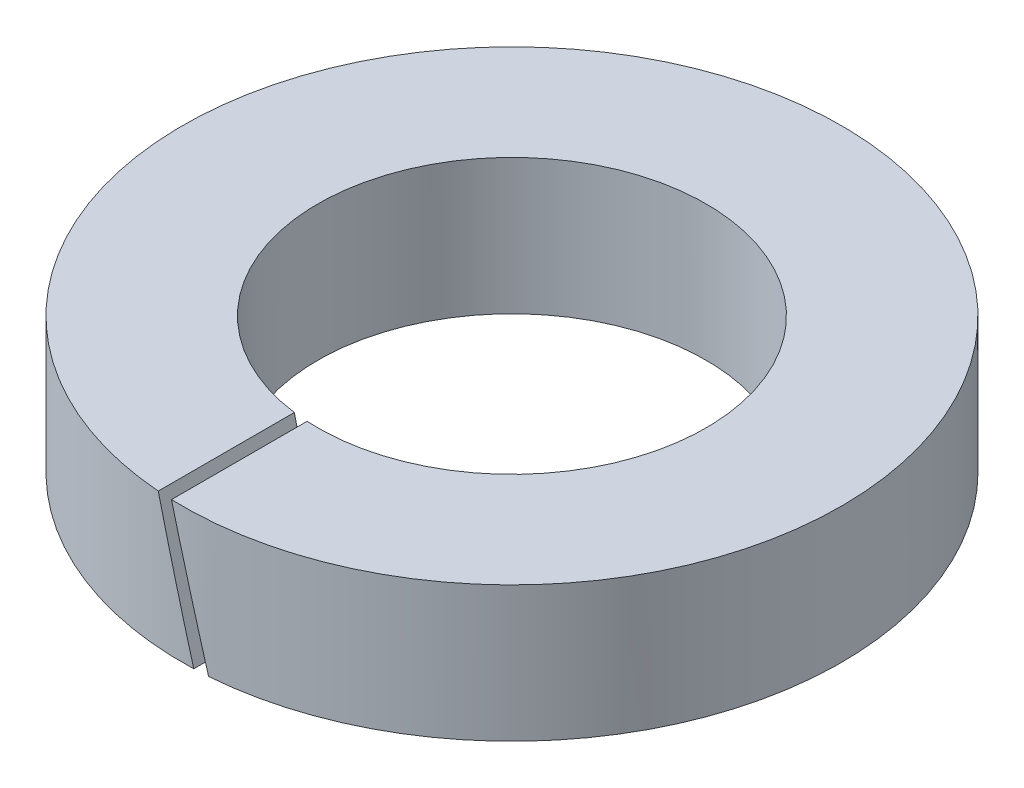
ISO-10303-21;
HEADER;
FILE_DESCRIPTION(('STEP AP214'),'2;1');
FILE_NAME('part.step','',(''),(''),'','','');
FILE_SCHEMA(('AUTOMOTIVE_DESIGN { 1 0 10303 214 1 1 1 1 }'));
ENDSEC;
DATA;
#1=APPLICATION_CONTEXT('core data for automotive mechanical design processes');
#2=APPLICATION_PROTOCOL_DEFINITION('international standard','automotive_design',2000,#1);
#3=PRODUCT_CONTEXT('',#1,'mechanical');
#4=PRODUCT('Part','Part','',(#3));
#5=PRODUCT_RELATED_PRODUCT_CATEGORY('part','',(#4));
#6=PRODUCT_DEFINITION_FORMATION('','',#4);
#7=PRODUCT_DEFINITION_CONTEXT('part definition',#1,'design');
#8=PRODUCT_DEFINITION('design','',#6,#7);
#9=PRODUCT_DEFINITION_SHAPE('','',#8);
#10=(LENGTH_UNIT() NAMED_UNIT(*) SI_UNIT(.MILLI.,.METRE.));
#11=(NAMED_UNIT(*) PLANE_ANGLE_UNIT() SI_UNIT($,.RADIAN.));
#12=(NAMED_UNIT(*) SI_UNIT($,.STERADIAN.) SOLID_ANGLE_UNIT());
#13=UNCERTAINTY_MEASURE_WITH_UNIT(LENGTH_MEASURE(1.E-05),#10,'distance_accuracy_value','');
#14=(GEOMETRIC_REPRESENTATION_CONTEXT(3) GLOBAL_UNCERTAINTY_ASSIGNED_CONTEXT((#13)) GLOBAL_UNIT_ASSIGNED_CONTEXT((#10,
#11,#12)) REPRESENTATION_CONTEXT('',''));
#15=CARTESIAN_POINT('',(0.,0.,0.));
#16=DIRECTION('',(0.,0.,1.));
#17=DIRECTION('',(1.,0.,0.));
#18=AXIS2_PLACEMENT_3D('',#15,#16,#17);
#19=CARTESIAN_POINT('',(0.,0.5,0.));
#20=DIRECTION('',(0.,1.,0.));
#21=DIRECTION('',(0.,0.,1.));
#22=AXIS2_PLACEMENT_3D('',#19,#20,#21);
#23=CYLINDRICAL_SURFACE('',#22,2.15);
#24=CARTESIAN_POINT('',(0.,1.03977774788672,0.));
#25=DIRECTION('',(-0.965925826289068,-0.258819045102522,0.));
#26=DIRECTION('',(-0.258819045102522,0.965925826289068,0.));
#27=AXIS2_PLACEMENT_3D('',#24,#25,#26);
#28=ELLIPSE('',#27,8.30696210608594,2.15);
#29=CARTESIAN_POINT('',(0.2786076078541,0.,2.13187190066519));
#30=VERTEX_POINT('',#29);
#31=CARTESIAN_POINT('',(-0.123316180792587,1.5,2.14646060284244));
#32=VERTEX_POINT('',#31);
#33=EDGE_CURVE('E48',#30,#32,#28,.T.);
#34=ORIENTED_EDGE('',*,*,#33,.T.);
#35=CARTESIAN_POINT('',(0.,1.5,0.));
#36=DIRECTION('',(0.,1.,0.));
#37=DIRECTION('',(0.,0.,1.));
#38=AXIS2_PLACEMENT_3D('',#35,#36,#37);
#39=CIRCLE('',#38,2.15);
#40=CARTESIAN_POINT('',(-0.278607607854099,1.5,2.13187190066519));
#41=VERTEX_POINT('',#40);
#42=EDGE_CURVE('E11',#32,#41,#39,.T.);
#43=ORIENTED_EDGE('',*,*,#42,.T.);
#44=CARTESIAN_POINT('',(0.,0.460222252113282,0.));
#45=DIRECTION('',(-0.965925826289068,-0.258819045102522,0.));
#46=DIRECTION('',(-0.258819045102522,0.965925826289068,0.));
#47=AXIS2_PLACEMENT_3D('',#44,#45,#46);
#48=ELLIPSE('',#47,8.30696210608594,2.15);
#49=CARTESIAN_POINT('',(0.123316180792587,0.,2.14646060284244));
#50=VERTEX_POINT('',#49);
#51=EDGE_CURVE('E97',#50,#41,#48,.T.);
#52=ORIENTED_EDGE('',*,*,#51,.F.);
#53=CARTESIAN_POINT('',(0.,0.,0.));
#54=DIRECTION('',(0.,1.,0.));
#55=DIRECTION('',(0.,0.,1.));
#56=AXIS2_PLACEMENT_3D('',#53,#54,#55);
#57=CIRCLE('',#56,2.15);
#58=EDGE_CURVE('E90',#30,#50,#57,.T.);
#59=ORIENTED_EDGE('',*,*,#58,.F.);
#60=EDGE_LOOP('',(#34,#43,#52,#59));
#61=FACE_BOUND('',#60,.T.);
#62=ADVANCED_FACE('F34',(#61),#23,.F.);
#63=CARTESIAN_POINT('',(2.15,1.5,0.));
#64=DIRECTION('',(0.,-1.,0.));
#65=DIRECTION('',(0.,0.,-1.));
#66=AXIS2_PLACEMENT_3D('',#63,#64,#65);
#67=PLANE('',#66);
#68=DIRECTION('',(0.,0.,1.));
#69=VECTOR('',#68,1.);
#70=CARTESIAN_POINT('',(-0.123316180792587,1.5,-3.651));
#71=LINE('',#70,#69);
#72=CARTESIAN_POINT('',(-0.123316180792587,1.5,3.64791627090792));
#73=VERTEX_POINT('',#72);
#74=EDGE_CURVE('E75',#32,#73,#71,.T.);
#75=ORIENTED_EDGE('',*,*,#74,.T.);
#76=CARTESIAN_POINT('',(0.,1.5,0.));
#77=DIRECTION('',(0.,1.,0.));
#78=DIRECTION('',(0.,0.,1.));
#79=AXIS2_PLACEMENT_3D('',#76,#77,#78);
#80=CIRCLE('',#79,3.65);
#81=CARTESIAN_POINT('',(-0.278607607854099,1.5,3.63935128846417));
#82=VERTEX_POINT('',#81);
#83=EDGE_CURVE('E41',#73,#82,#80,.T.);
#84=ORIENTED_EDGE('',*,*,#83,.T.);
#85=DIRECTION('',(0.,0.,1.));
#86=VECTOR('',#85,1.);
#87=CARTESIAN_POINT('',(-0.278607607854099,1.5,-3.651));
#88=LINE('',#87,#86);
#89=EDGE_CURVE('E99',#41,#82,#88,.T.);
#90=ORIENTED_EDGE('',*,*,#89,.F.);
#91=ORIENTED_EDGE('',*,*,#42,.F.);
#92=EDGE_LOOP('',(#75,#84,#90,#91));
#93=FACE_BOUND('',#92,.T.);
#94=ADVANCED_FACE('F85',(#93),#67,.F.);
#95=CARTESIAN_POINT('',(0.,0.5,0.));
#96=DIRECTION('',(0.,1.,0.));
#97=DIRECTION('',(0.,0.,1.));
#98=AXIS2_PLACEMENT_3D('',#95,#96,#97);
#99=CYLINDRICAL_SURFACE('',#98,3.65);
#100=CARTESIAN_POINT('',(0.,1.03977774788672,0.));
#101=DIRECTION('',(-0.965925826289068,-0.258819045102522,0.));
#102=DIRECTION('',(-0.258819045102522,0.965925826289068,0.));
#103=AXIS2_PLACEMENT_3D('',#100,#101,#102);
#104=ELLIPSE('',#103,14.1025170638203,3.65);
#105=CARTESIAN_POINT('',(0.2786076078541,0.,3.63935128846417));
#106=VERTEX_POINT('',#105);
#107=EDGE_CURVE('E72',#73,#106,#104,.F.);
#108=ORIENTED_EDGE('',*,*,#107,.T.);
#109=CARTESIAN_POINT('',(0.,0.,0.));
#110=DIRECTION('',(0.,1.,0.));
#111=DIRECTION('',(0.,0.,1.));
#112=AXIS2_PLACEMENT_3D('',#109,#110,#111);
#113=CIRCLE('',#112,3.65);
#114=CARTESIAN_POINT('',(0.123316180792587,0.,3.64791627090792));
#115=VERTEX_POINT('',#114);
#116=EDGE_CURVE('E89',#106,#115,#113,.T.);
#117=ORIENTED_EDGE('',*,*,#116,.T.);
#118=CARTESIAN_POINT('',(0.,0.460222252113282,0.));
#119=DIRECTION('',(-0.965925826289068,-0.258819045102522,0.));
#120=DIRECTION('',(-0.258819045102522,0.965925826289068,0.));
#121=AXIS2_PLACEMENT_3D('',#118,#119,#120);
#122=ELLIPSE('',#121,14.1025170638203,3.65);
#123=EDGE_CURVE('E56',#82,#115,#122,.F.);
#124=ORIENTED_EDGE('',*,*,#123,.F.);
#125=ORIENTED_EDGE('',*,*,#83,.F.);
#126=EDGE_LOOP('',(#108,#117,#124,#125));
#127=FACE_BOUND('',#126,.T.);
#128=ADVANCED_FACE('F88',(#127),#99,.T.);
#129=CARTESIAN_POINT('',(2.15,0.,0.));
#130=DIRECTION('',(0.,1.,0.));
#131=DIRECTION('',(0.,0.,1.));
#132=AXIS2_PLACEMENT_3D('',#129,#130,#131);
#133=PLANE('',#132);
#134=DIRECTION('',(0.,0.,-1.));
#135=VECTOR('',#134,1.);
#136=CARTESIAN_POINT('',(0.2786076078541,0.,-3.651));
#137=LINE('',#136,#135);
#138=EDGE_CURVE('E76',#106,#30,#137,.T.);
#139=ORIENTED_EDGE('',*,*,#138,.T.);
#140=ORIENTED_EDGE('',*,*,#58,.T.);
#141=DIRECTION('',(0.,0.,-1.));
#142=VECTOR('',#141,1.);
#143=CARTESIAN_POINT('',(0.123316180792587,0.,-3.651));
#144=LINE('',#143,#142);
#145=EDGE_CURVE('E101',#115,#50,#144,.T.);
#146=ORIENTED_EDGE('',*,*,#145,.F.);
#147=ORIENTED_EDGE('',*,*,#116,.F.);
#148=EDGE_LOOP('',(#139,#140,#146,#147));
#149=FACE_BOUND('',#148,.T.);
#150=ADVANCED_FACE('F108',(#149),#133,.F.);
#151=CARTESIAN_POINT('',(-0.0724444369716801,0.730588571617311,-3.651));
#152=DIRECTION('',(-0.965925826289068,-0.258819045102522,0.));
#153=DIRECTION('',(0.258819045102522,-0.965925826289068,0.));
#154=AXIS2_PLACEMENT_3D('',#151,#152,#153);
#155=PLANE('',#154);
#156=ORIENTED_EDGE('',*,*,#51,.T.);
#157=ORIENTED_EDGE('',*,*,#89,.T.);
#158=ORIENTED_EDGE('',*,*,#123,.T.);
#159=ORIENTED_EDGE('',*,*,#145,.T.);
#160=EDGE_LOOP('',(#156,#157,#158,#159));
#161=FACE_BOUND('',#160,.T.);
#162=ADVANCED_FACE('F104',(#161),#155,.F.);
#163=CARTESIAN_POINT('',(0.0724444369716801,0.76941142838269,-3.651));
#164=DIRECTION('',(-0.965925826289068,-0.258819045102522,0.));
#165=DIRECTION('',(0.258819045102522,-0.965925826289068,0.));
#166=AXIS2_PLACEMENT_3D('',#163,#164,#165);
#167=PLANE('',#166);
#168=ORIENTED_EDGE('',*,*,#138,.F.);
#169=ORIENTED_EDGE('',*,*,#107,.F.);
#170=ORIENTED_EDGE('',*,*,#74,.F.);
#171=ORIENTED_EDGE('',*,*,#33,.F.);
#172=EDGE_LOOP('',(#168,#169,#170,#171));
#173=FACE_BOUND('',#172,.T.);
#174=ADVANCED_FACE('F74',(#173),#167,.T.);
#175=CLOSED_SHELL('',(#62,#94,#128,#150,#162,#174));
#176=MANIFOLD_SOLID_BREP('B2',#175);
#177=ADVANCED_BREP_SHAPE_REPRESENTATION('',(#18,#176),#14);
#178=SHAPE_DEFINITION_REPRESENTATION(#9,#177);
ENDSEC;
END-ISO-10303-21;
